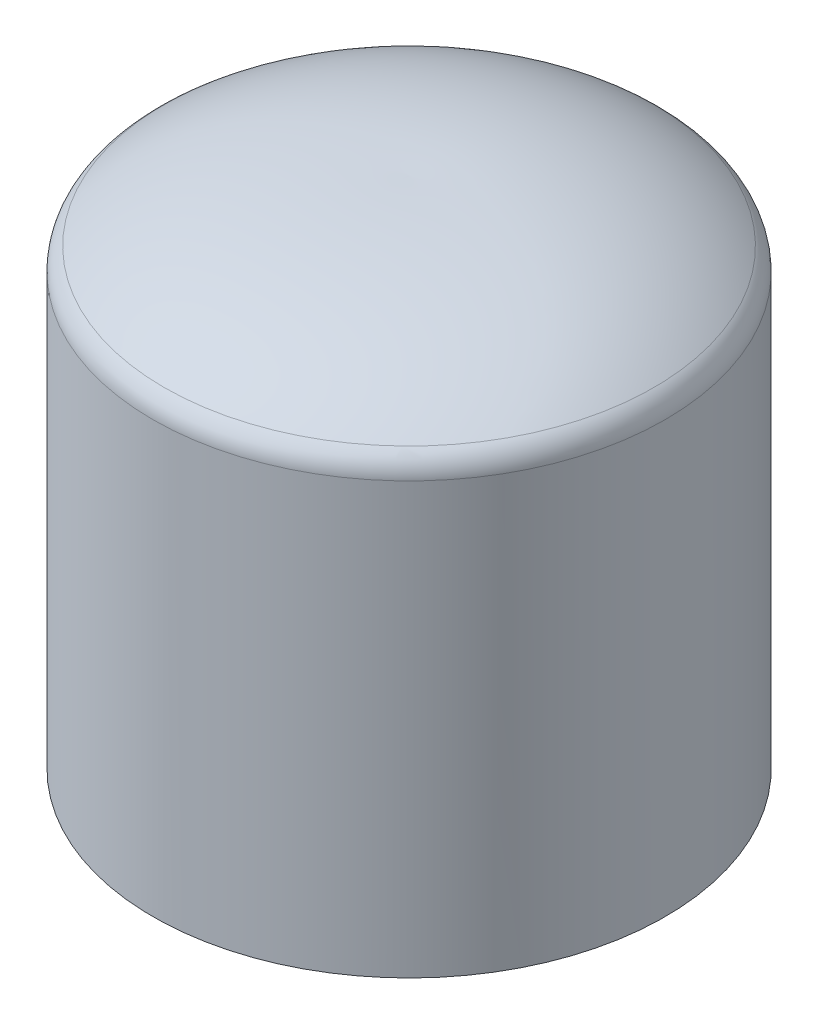
ISO-10303-21;
HEADER;
FILE_DESCRIPTION(('STEP AP214'),'2;1');
FILE_NAME('part.step','',(''),(''),'','','');
FILE_SCHEMA(('AUTOMOTIVE_DESIGN { 1 0 10303 214 1 1 1 1 }'));
ENDSEC;
DATA;
#1=APPLICATION_CONTEXT('core data for automotive mechanical design processes');
#2=APPLICATION_PROTOCOL_DEFINITION('international standard','automotive_design',2000,#1);
#3=PRODUCT_CONTEXT('',#1,'mechanical');
#4=PRODUCT('Part','Part','',(#3));
#5=PRODUCT_RELATED_PRODUCT_CATEGORY('part','',(#4));
#6=PRODUCT_DEFINITION_FORMATION('','',#4);
#7=PRODUCT_DEFINITION_CONTEXT('part definition',#1,'design');
#8=PRODUCT_DEFINITION('design','',#6,#7);
#9=PRODUCT_DEFINITION_SHAPE('','',#8);
#10=(LENGTH_UNIT() NAMED_UNIT(*) SI_UNIT(.MILLI.,.METRE.));
#11=(NAMED_UNIT(*) PLANE_ANGLE_UNIT() SI_UNIT($,.RADIAN.));
#12=(NAMED_UNIT(*) SI_UNIT($,.STERADIAN.) SOLID_ANGLE_UNIT());
#13=UNCERTAINTY_MEASURE_WITH_UNIT(LENGTH_MEASURE(1.E-05),#10,'distance_accuracy_value','');
#14=(GEOMETRIC_REPRESENTATION_CONTEXT(3) GLOBAL_UNCERTAINTY_ASSIGNED_CONTEXT((#13)) GLOBAL_UNIT_ASSIGNED_CONTEXT((#10,
#11,#12)) REPRESENTATION_CONTEXT('',''));
#15=CARTESIAN_POINT('',(0.,0.,0.));
#16=DIRECTION('',(0.,0.,1.));
#17=DIRECTION('',(1.,0.,0.));
#18=AXIS2_PLACEMENT_3D('',#15,#16,#17);
#19=CARTESIAN_POINT('',(0.,0.,13.9192));
#20=DIRECTION('',(0.,1.,0.));
#21=DIRECTION('',(0.,0.,1.));
#22=AXIS2_PLACEMENT_3D('',#19,#20,#21);
#23=PLANE('',#22);
#24=CARTESIAN_POINT('',(0.,0.,0.));
#25=DIRECTION('',(0.,1.,0.));
#26=DIRECTION('',(0.,0.,1.));
#27=AXIS2_PLACEMENT_3D('',#24,#25,#26);
#28=CIRCLE('',#27,11.2522);
#29=CARTESIAN_POINT('',(0.,0.,11.2522));
#30=VERTEX_POINT('',#29);
#31=EDGE_CURVE('E71',#30,#30,#28,.T.);
#32=ORIENTED_EDGE('',*,*,#31,.T.);
#33=EDGE_LOOP('',(#32));
#34=FACE_BOUND('',#33,.T.);
#35=CARTESIAN_POINT('',(0.,0.,0.));
#36=DIRECTION('',(0.,-1.,0.));
#37=DIRECTION('',(0.,0.,-1.));
#38=AXIS2_PLACEMENT_3D('',#35,#36,#37);
#39=CIRCLE('',#38,13.9192);
#40=CARTESIAN_POINT('',(0.,0.,-13.9192));
#41=VERTEX_POINT('',#40);
#42=EDGE_CURVE('E57',#41,#41,#39,.T.);
#43=ORIENTED_EDGE('',*,*,#42,.T.);
#44=EDGE_LOOP('',(#43));
#45=FACE_BOUND('',#44,.T.);
#46=ADVANCED_FACE('F32',(#34,#45),#23,.F.);
#47=CARTESIAN_POINT('',(0.,0.,0.));
#48=DIRECTION('',(0.,-1.,0.));
#49=DIRECTION('',(0.,0.,-1.));
#50=AXIS2_PLACEMENT_3D('',#47,#48,#49);
#51=CYLINDRICAL_SURFACE('',#50,10.7442);
#52=CARTESIAN_POINT('',(0.,0.507999999999997,0.));
#53=DIRECTION('',(0.,1.,0.));
#54=DIRECTION('',(0.,0.,1.));
#55=AXIS2_PLACEMENT_3D('',#52,#53,#54);
#56=CIRCLE('',#55,10.7442);
#57=CARTESIAN_POINT('',(0.,0.507999999999997,10.7442));
#58=VERTEX_POINT('',#57);
#59=EDGE_CURVE('E68',#58,#58,#56,.F.);
#60=ORIENTED_EDGE('',*,*,#59,.T.);
#61=EDGE_LOOP('',(#60));
#62=FACE_BOUND('',#61,.T.);
#63=CARTESIAN_POINT('',(0.,22.4101978061666,0.));
#64=DIRECTION('',(0.,-1.,0.));
#65=DIRECTION('',(0.,0.,-1.));
#66=AXIS2_PLACEMENT_3D('',#63,#64,#65);
#67=CIRCLE('',#66,10.7442);
#68=CARTESIAN_POINT('',(0.,22.4101978061666,-10.7442));
#69=VERTEX_POINT('',#68);
#70=EDGE_CURVE('E60',#69,#69,#67,.T.);
#71=ORIENTED_EDGE('',*,*,#70,.F.);
#72=EDGE_LOOP('',(#71));
#73=FACE_BOUND('',#72,.T.);
#74=ADVANCED_FACE('F88',(#62,#73),#51,.F.);
#75=CARTESIAN_POINT('',(0.,22.4101978061666,10.3430141880362));
#76=DIRECTION('',(0.,1.,0.));
#77=DIRECTION('',(0.,0.,1.));
#78=AXIS2_PLACEMENT_3D('',#75,#76,#77);
#79=PLANE('',#78);
#80=CARTESIAN_POINT('',(0.,22.4101978061666,0.));
#81=DIRECTION('',(0.,-1.,0.));
#82=DIRECTION('',(0.,0.,-1.));
#83=AXIS2_PLACEMENT_3D('',#80,#81,#82);
#84=CIRCLE('',#83,10.3430141880362);
#85=CARTESIAN_POINT('',(0.,22.4101978061666,-10.3430141880362));
#86=VERTEX_POINT('',#85);
#87=EDGE_CURVE('E56',#86,#86,#84,.T.);
#88=ORIENTED_EDGE('',*,*,#87,.F.);
#89=EDGE_LOOP('',(#88));
#90=FACE_BOUND('',#89,.T.);
#91=ORIENTED_EDGE('',*,*,#70,.T.);
#92=EDGE_LOOP('',(#91));
#93=FACE_BOUND('',#92,.T.);
#94=ADVANCED_FACE('F94',(#90,#93),#79,.F.);
#95=CARTESIAN_POINT('',(0.,0.,0.));
#96=DIRECTION('',(0.,-1.,0.));
#97=DIRECTION('',(0.,0.,-1.));
#98=AXIS2_PLACEMENT_3D('',#95,#96,#97);
#99=CYLINDRICAL_SURFACE('',#98,10.3430141880362);
#100=CARTESIAN_POINT('',(0.,23.1158175703424,0.));
#101=DIRECTION('',(0.,-1.,0.));
#102=DIRECTION('',(0.,0.,-1.));
#103=AXIS2_PLACEMENT_3D('',#100,#101,#102);
#104=CIRCLE('',#103,10.3430141880362);
#105=CARTESIAN_POINT('',(0.,23.1158175703424,-10.3430141880362));
#106=VERTEX_POINT('',#105);
#107=EDGE_CURVE('E54',#106,#106,#104,.T.);
#108=ORIENTED_EDGE('',*,*,#107,.F.);
#109=EDGE_LOOP('',(#108));
#110=FACE_BOUND('',#109,.T.);
#111=ORIENTED_EDGE('',*,*,#87,.T.);
#112=EDGE_LOOP('',(#111));
#113=FACE_BOUND('',#112,.T.);
#114=ADVANCED_FACE('F50',(#110,#113),#99,.F.);
#115=CARTESIAN_POINT('',(0.,23.1158175703424,10.3430141880362));
#116=CARTESIAN_POINT('',(0.,24.7329853558941,7.1333226158339));
#117=CARTESIAN_POINT('',(0.,25.5194053042827,3.68565121987383));
#118=CARTESIAN_POINT('',(0.,25.4750774155869,0.));
#119=B_SPLINE_CURVE_WITH_KNOTS('',3,(#115,#116,#117,#118),.UNSPECIFIED.,.F.,.F.,(4,4),
(0.0401168862938023,1.),.UNSPECIFIED.);
#120=CARTESIAN_POINT('',(0.,0.,0.));
#121=DIRECTION('',(0.,-1.,0.));
#122=AXIS1_PLACEMENT('',#120,#121);
#123=SURFACE_OF_REVOLUTION('',#119,#122);
#124=CARTESIAN_POINT('',(0.,25.4750774155869,0.));
#125=VERTEX_POINT('',#124);
#126=VERTEX_LOOP('',#125);
#127=FACE_BOUND('',#126,.T.);
#128=ORIENTED_EDGE('',*,*,#107,.T.);
#129=EDGE_LOOP('',(#128));
#130=FACE_BOUND('',#129,.T.);
#131=ADVANCED_FACE('F46',(#127,#130),#123,.T.);
#132=CARTESIAN_POINT('',(0.,27.94,0.));
#133=CARTESIAN_POINT('',(0.,28.0855719394089,4.86398701045588));
#134=CARTESIAN_POINT('',(0.,27.4116281215645,10.0665596637516));
#135=CARTESIAN_POINT('',(0.,24.13,13.9192));
#136=B_SPLINE_CURVE_WITH_KNOTS('',3,(#132,#133,#134,#135),.UNSPECIFIED.,.F.,.F.,(4,4),(0.,1.),.UNSPECIFIED.);
#137=CARTESIAN_POINT('',(0.,0.,0.));
#138=DIRECTION('',(0.,-1.,0.));
#139=AXIS1_PLACEMENT('',#137,#138);
#140=SURFACE_OF_REVOLUTION('',#136,#139);
#141=CARTESIAN_POINT('',(0.,24.6152496487877,0.));
#142=DIRECTION('',(0.,-1.,0.));
#143=DIRECTION('',(0.,0.,-1.));
#144=AXIS2_PLACEMENT_3D('',#141,#142,#143);
#145=CIRCLE('',#144,13.3151177575495);
#146=CARTESIAN_POINT('',(0.,24.6152496487877,-13.3151177575495));
#147=VERTEX_POINT('',#146);
#148=EDGE_CURVE('E11',#147,#147,#145,.F.);
#149=ORIENTED_EDGE('',*,*,#148,.T.);
#150=EDGE_LOOP('',(#149));
#151=FACE_BOUND('',#150,.T.);
#152=CARTESIAN_POINT('',(0.,27.94,0.));
#153=VERTEX_POINT('',#152);
#154=VERTEX_LOOP('',#153);
#155=FACE_BOUND('',#154,.T.);
#156=ADVANCED_FACE('F49',(#151,#155),#140,.T.);
#157=CARTESIAN_POINT('',(0.,0.,0.));
#158=DIRECTION('',(0.,-1.,0.));
#159=DIRECTION('',(0.,0.,-1.));
#160=AXIS2_PLACEMENT_3D('',#157,#158,#159);
#161=CYLINDRICAL_SURFACE('',#160,13.9192);
#162=CARTESIAN_POINT('',(0.,23.400207542791,0.));
#163=DIRECTION('',(0.,1.,0.));
#164=DIRECTION('',(0.,0.,1.));
#165=AXIS2_PLACEMENT_3D('',#162,#163,#164);
#166=CIRCLE('',#165,13.9192);
#167=CARTESIAN_POINT('',(0.,23.400207542791,13.9192));
#168=VERTEX_POINT('',#167);
#169=EDGE_CURVE('E40',#168,#168,#166,.F.);
#170=ORIENTED_EDGE('',*,*,#169,.T.);
#171=EDGE_LOOP('',(#170));
#172=FACE_BOUND('',#171,.T.);
#173=ORIENTED_EDGE('',*,*,#42,.F.);
#174=EDGE_LOOP('',(#173));
#175=FACE_BOUND('',#174,.T.);
#176=ADVANCED_FACE('F76',(#172,#175),#161,.T.);
#177=CARTESIAN_POINT('',(0.,0.507999999999997,0.));
#178=DIRECTION('',(0.,1.,0.));
#179=DIRECTION('',(0.,0.,1.));
#180=AXIS2_PLACEMENT_3D('',#177,#178,#179);
#181=TOROIDAL_SURFACE('',#180,11.2522,0.508);
#182=ORIENTED_EDGE('',*,*,#31,.F.);
#183=EDGE_LOOP('',(#182));
#184=FACE_BOUND('',#183,.T.);
#185=ORIENTED_EDGE('',*,*,#59,.F.);
#186=EDGE_LOOP('',(#185));
#187=FACE_BOUND('',#186,.T.);
#188=ADVANCED_FACE('F80',(#184,#187),#181,.T.);
#189=CARTESIAN_POINT('',(0.,23.400207542791,0.));
#190=DIRECTION('',(0.,1.,0.));
#191=DIRECTION('',(0.,0.,1.));
#192=AXIS2_PLACEMENT_3D('',#189,#190,#191);
#193=TOROIDAL_SURFACE('',#192,12.3952,1.524);
#194=ORIENTED_EDGE('',*,*,#148,.F.);
#195=EDGE_LOOP('',(#194));
#196=FACE_BOUND('',#195,.T.);
#197=ORIENTED_EDGE('',*,*,#169,.F.);
#198=EDGE_LOOP('',(#197));
#199=FACE_BOUND('',#198,.T.);
#200=ADVANCED_FACE('F34',(#196,#199),#193,.T.);
#201=CLOSED_SHELL('',(#46,#74,#94,#114,#131,#156,#176,#188,#200));
#202=MANIFOLD_SOLID_BREP('B2',#201);
#203=ADVANCED_BREP_SHAPE_REPRESENTATION('',(#18,#202),#14);
#204=SHAPE_DEFINITION_REPRESENTATION(#9,#203);
ENDSEC;
END-ISO-10303-21;
